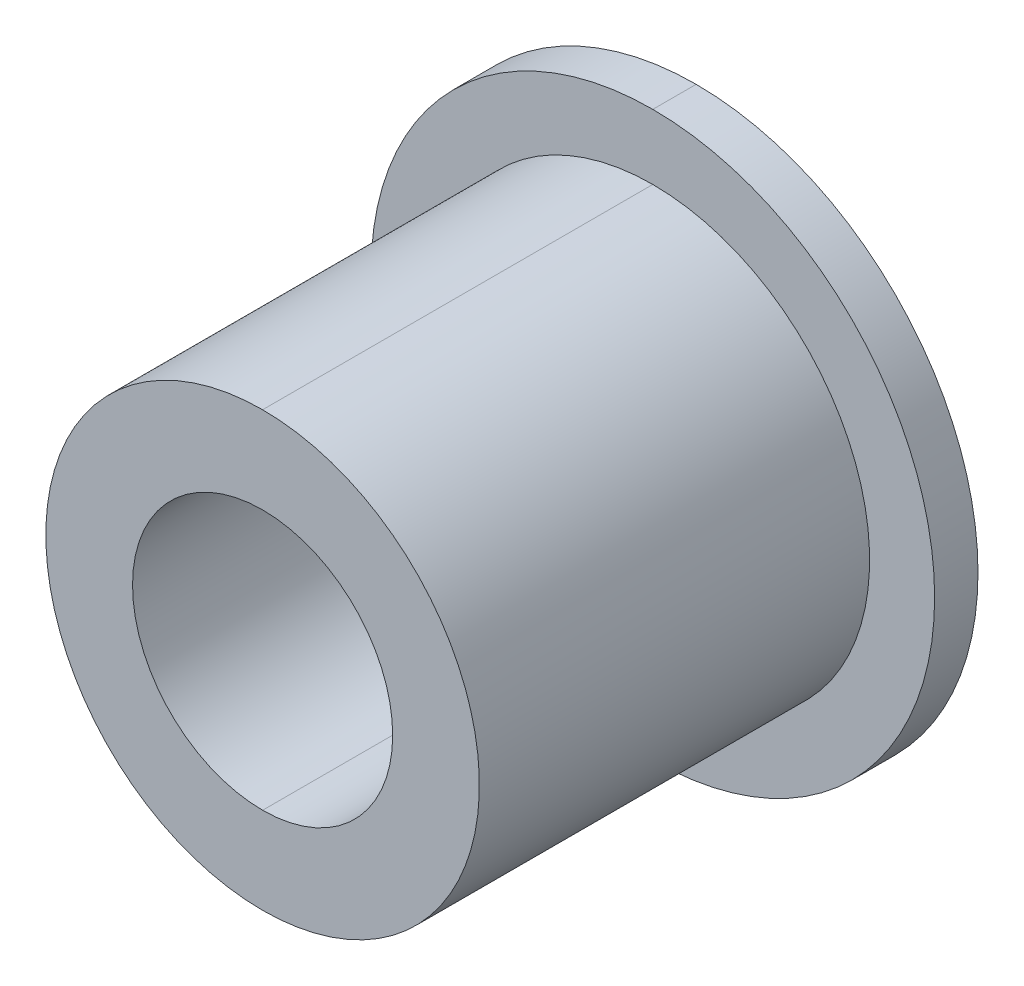
ISO-10303-21;
HEADER;
FILE_DESCRIPTION(('STEP AP214'),'2;1');
FILE_NAME('part.step','',(''),(''),'','','');
FILE_SCHEMA(('AUTOMOTIVE_DESIGN { 1 0 10303 214 1 1 1 1 }'));
ENDSEC;
DATA;
#1=APPLICATION_CONTEXT('core data for automotive mechanical design processes');
#2=APPLICATION_PROTOCOL_DEFINITION('international standard','automotive_design',2000,#1);
#3=PRODUCT_CONTEXT('',#1,'mechanical');
#4=PRODUCT('Part','Part','',(#3));
#5=PRODUCT_RELATED_PRODUCT_CATEGORY('part','',(#4));
#6=PRODUCT_DEFINITION_FORMATION('','',#4);
#7=PRODUCT_DEFINITION_CONTEXT('part definition',#1,'design');
#8=PRODUCT_DEFINITION('design','',#6,#7);
#9=PRODUCT_DEFINITION_SHAPE('','',#8);
#10=(LENGTH_UNIT() NAMED_UNIT(*) SI_UNIT(.MILLI.,.METRE.));
#11=(NAMED_UNIT(*) PLANE_ANGLE_UNIT() SI_UNIT($,.RADIAN.));
#12=(NAMED_UNIT(*) SI_UNIT($,.STERADIAN.) SOLID_ANGLE_UNIT());
#13=UNCERTAINTY_MEASURE_WITH_UNIT(LENGTH_MEASURE(1.E-05),#10,'distance_accuracy_value','');
#14=(GEOMETRIC_REPRESENTATION_CONTEXT(3) GLOBAL_UNCERTAINTY_ASSIGNED_CONTEXT((#13)) GLOBAL_UNIT_ASSIGNED_CONTEXT((#10,
#11,#12)) REPRESENTATION_CONTEXT('',''));
#15=CARTESIAN_POINT('',(0.,0.,0.));
#16=DIRECTION('',(0.,0.,1.));
#17=DIRECTION('',(1.,0.,0.));
#18=AXIS2_PLACEMENT_3D('',#15,#16,#17);
#19=CARTESIAN_POINT('',(-271.1665276998,264.3745773803,-6.700000380954));
#20=DIRECTION('',(0.,0.,-1.));
#21=DIRECTION('',(0.,-1.,0.));
#22=AXIS2_PLACEMENT_3D('',#19,#20,#21);
#23=PLANE('',#22);
#24=CARTESIAN_POINT('',(-271.1665276998,265.1245773803,-6.700000380954));
#25=DIRECTION('',(0.,0.,1.));
#26=DIRECTION('',(0.,1.,0.));
#27=AXIS2_PLACEMENT_3D('',#24,#25,#26);
#28=CIRCLE('',#27,1.5);
#29=CARTESIAN_POINT('',(-271.1665276998,266.6245773803,-6.700000380954));
#30=VERTEX_POINT('',#29);
#31=CARTESIAN_POINT('',(-271.1665276998,263.6245773803,-6.700000380954));
#32=VERTEX_POINT('',#31);
#33=EDGE_CURVE('E11',#30,#32,#28,.T.);
#34=ORIENTED_EDGE('',*,*,#33,.T.);
#35=CARTESIAN_POINT('',(-271.1665276998,265.1245773803,-6.700000380954));
#36=DIRECTION('',(0.,0.,1.));
#37=DIRECTION('',(0.,-1.,0.));
#38=AXIS2_PLACEMENT_3D('',#35,#36,#37);
#39=CIRCLE('',#38,1.5);
#40=EDGE_CURVE('E50',#32,#30,#39,.T.);
#41=ORIENTED_EDGE('',*,*,#40,.T.);
#42=EDGE_LOOP('',(#34,#41));
#43=FACE_BOUND('',#42,.T.);
#44=ADVANCED_FACE('F16',(#43),#23,.F.);
#45=CARTESIAN_POINT('',(-271.1665276998,265.1245773803,-1.600000380954));
#46=DIRECTION('',(0.,0.,-1.));
#47=DIRECTION('',(0.,-1.,0.));
#48=AXIS2_PLACEMENT_3D('',#45,#46,#47);
#49=CYLINDRICAL_SURFACE('',#48,1.5);
#50=CARTESIAN_POINT('',(-271.1665276998,265.1245773803,-1.800000380954));
#51=DIRECTION('',(0.,0.,-1.));
#52=DIRECTION('',(0.,-1.,0.));
#53=AXIS2_PLACEMENT_3D('',#50,#51,#52);
#54=CIRCLE('',#53,1.5);
#55=CARTESIAN_POINT('',(-271.1665276998,263.6245773803,-1.800000380954));
#56=VERTEX_POINT('',#55);
#57=CARTESIAN_POINT('',(-271.1665276998,266.6245773803,-1.800000380954));
#58=VERTEX_POINT('',#57);
#59=EDGE_CURVE('E46',#56,#58,#54,.T.);
#60=ORIENTED_EDGE('',*,*,#59,.F.);
#61=DIRECTION('',(0.,0.,1.));
#62=VECTOR('',#61,1.);
#63=CARTESIAN_POINT('',(-271.1665276998,263.6245773803,-6.700000380954));
#64=LINE('',#63,#62);
#65=EDGE_CURVE('E25',#32,#56,#64,.T.);
#66=ORIENTED_EDGE('',*,*,#65,.F.);
#67=ORIENTED_EDGE('',*,*,#33,.F.);
#68=DIRECTION('',(0.,0.,1.));
#69=VECTOR('',#68,1.);
#70=CARTESIAN_POINT('',(-271.1665276998,266.6245773803,-6.700000380954));
#71=LINE('',#70,#69);
#72=EDGE_CURVE('E42',#30,#58,#71,.T.);
#73=ORIENTED_EDGE('',*,*,#72,.T.);
#74=EDGE_LOOP('',(#60,#66,#67,#73));
#75=FACE_BOUND('',#74,.T.);
#76=ADVANCED_FACE('F44',(#75),#49,.F.);
#77=CARTESIAN_POINT('',(-271.1665276998,265.1245773803,-1.600000380954));
#78=DIRECTION('',(0.,0.,-1.));
#79=DIRECTION('',(0.,-1.,0.));
#80=AXIS2_PLACEMENT_3D('',#77,#78,#79);
#81=CYLINDRICAL_SURFACE('',#80,1.5);
#82=CARTESIAN_POINT('',(-271.1665276998,265.1245773803,-1.800000380954));
#83=DIRECTION('',(0.,0.,-1.));
#84=DIRECTION('',(0.,1.,0.));
#85=AXIS2_PLACEMENT_3D('',#82,#83,#84);
#86=CIRCLE('',#85,1.5);
#87=EDGE_CURVE('E51',#58,#56,#86,.T.);
#88=ORIENTED_EDGE('',*,*,#87,.F.);
#89=ORIENTED_EDGE('',*,*,#72,.F.);
#90=ORIENTED_EDGE('',*,*,#40,.F.);
#91=ORIENTED_EDGE('',*,*,#65,.T.);
#92=EDGE_LOOP('',(#88,#89,#90,#91));
#93=FACE_BOUND('',#92,.T.);
#94=ADVANCED_FACE('F54',(#93),#81,.F.);
#95=CARTESIAN_POINT('',(-271.1665276998,265.1245773803,-2.300000380954));
#96=DIRECTION('',(0.,0.,-1.));
#97=DIRECTION('',(0.,-1.,0.));
#98=AXIS2_PLACEMENT_3D('',#95,#96,#97);
#99=CYLINDRICAL_SURFACE('',#98,2.5);
#100=CARTESIAN_POINT('',(-271.1665276998,265.1245773803,-1.800000380954));
#101=DIRECTION('',(0.,0.,1.));
#102=DIRECTION('',(0.,1.,0.));
#103=AXIS2_PLACEMENT_3D('',#100,#101,#102);
#104=CIRCLE('',#103,2.5);
#105=CARTESIAN_POINT('',(-271.1665276998,267.6245773803,-1.800000380954));
#106=VERTEX_POINT('',#105);
#107=CARTESIAN_POINT('',(-271.1665276998,262.6245773803,-1.800000380954));
#108=VERTEX_POINT('',#107);
#109=EDGE_CURVE('E61',#106,#108,#104,.T.);
#110=ORIENTED_EDGE('',*,*,#109,.F.);
#111=DIRECTION('',(0.,0.,1.));
#112=VECTOR('',#111,1.);
#113=CARTESIAN_POINT('',(-271.1665276998,267.6245773803,-6.300000380954));
#114=LINE('',#113,#112);
#115=CARTESIAN_POINT('',(-271.1665276998,267.6245773803,-6.300000380954));
#116=VERTEX_POINT('',#115);
#117=EDGE_CURVE('E123',#116,#106,#114,.T.);
#118=ORIENTED_EDGE('',*,*,#117,.F.);
#119=CARTESIAN_POINT('',(-271.1665276998,265.1245773803,-6.300000380954));
#120=DIRECTION('',(0.,0.,-1.));
#121=DIRECTION('',(0.,-1.,0.));
#122=AXIS2_PLACEMENT_3D('',#119,#120,#121);
#123=CIRCLE('',#122,2.5);
#124=CARTESIAN_POINT('',(-271.1665276998,262.6245773803,-6.300000380954));
#125=VERTEX_POINT('',#124);
#126=EDGE_CURVE('E140',#125,#116,#123,.T.);
#127=ORIENTED_EDGE('',*,*,#126,.F.);
#128=DIRECTION('',(0.,0.,1.));
#129=VECTOR('',#128,1.);
#130=CARTESIAN_POINT('',(-271.1665276998,262.6245773803,-6.300000380954));
#131=LINE('',#130,#129);
#132=EDGE_CURVE('E127',#125,#108,#131,.T.);
#133=ORIENTED_EDGE('',*,*,#132,.T.);
#134=EDGE_LOOP('',(#110,#118,#127,#133));
#135=FACE_BOUND('',#134,.T.);
#136=ADVANCED_FACE('F88',(#135),#99,.T.);
#137=CARTESIAN_POINT('',(-271.1665276998,263.1245773803,-1.800000380954));
#138=DIRECTION('',(0.,0.,-1.));
#139=DIRECTION('',(0.,-1.,0.));
#140=AXIS2_PLACEMENT_3D('',#137,#138,#139);
#141=PLANE('',#140);
#142=ORIENTED_EDGE('',*,*,#59,.T.);
#143=ORIENTED_EDGE('',*,*,#87,.T.);
#144=EDGE_LOOP('',(#142,#143));
#145=FACE_BOUND('',#144,.T.);
#146=ORIENTED_EDGE('',*,*,#109,.T.);
#147=CARTESIAN_POINT('',(-271.1665276998,265.1245773803,-1.800000380954));
#148=DIRECTION('',(0.,0.,1.));
#149=DIRECTION('',(0.,-1.,0.));
#150=AXIS2_PLACEMENT_3D('',#147,#148,#149);
#151=CIRCLE('',#150,2.5);
#152=EDGE_CURVE('E70',#108,#106,#151,.T.);
#153=ORIENTED_EDGE('',*,*,#152,.T.);
#154=EDGE_LOOP('',(#146,#153));
#155=FACE_BOUND('',#154,.T.);
#156=ADVANCED_FACE('F58',(#145,#155),#141,.F.);
#157=CARTESIAN_POINT('',(-271.1665276998,265.1245773803,-2.300000380954));
#158=DIRECTION('',(0.,0.,-1.));
#159=DIRECTION('',(0.,-1.,0.));
#160=AXIS2_PLACEMENT_3D('',#157,#158,#159);
#161=CYLINDRICAL_SURFACE('',#160,2.5);
#162=ORIENTED_EDGE('',*,*,#132,.F.);
#163=CARTESIAN_POINT('',(-271.1665276998,265.1245773803,-6.300000380954));
#164=DIRECTION('',(0.,0.,-1.));
#165=DIRECTION('',(0.,1.,0.));
#166=AXIS2_PLACEMENT_3D('',#163,#164,#165);
#167=CIRCLE('',#166,2.5);
#168=EDGE_CURVE('E130',#116,#125,#167,.T.);
#169=ORIENTED_EDGE('',*,*,#168,.F.);
#170=ORIENTED_EDGE('',*,*,#117,.T.);
#171=ORIENTED_EDGE('',*,*,#152,.F.);
#172=EDGE_LOOP('',(#162,#169,#170,#171));
#173=FACE_BOUND('',#172,.T.);
#174=ADVANCED_FACE('F106',(#173),#161,.T.);
#175=CARTESIAN_POINT('',(-271.1665276998,265.1245773803,-7.300000380954));
#176=DIRECTION('',(0.,0.,-1.));
#177=DIRECTION('',(0.,-1.,0.));
#178=AXIS2_PLACEMENT_3D('',#175,#176,#177);
#179=CYLINDRICAL_SURFACE('',#178,3.25);
#180=CARTESIAN_POINT('',(-271.1665276998,265.1245773803,-6.300000380954));
#181=DIRECTION('',(0.,0.,1.));
#182=DIRECTION('',(0.,1.,0.));
#183=AXIS2_PLACEMENT_3D('',#180,#181,#182);
#184=CIRCLE('',#183,3.25);
#185=CARTESIAN_POINT('',(-271.1665276998,268.3745773803,-6.300000380954));
#186=VERTEX_POINT('',#185);
#187=CARTESIAN_POINT('',(-271.1665276998,261.8745773803,-6.300000380954));
#188=VERTEX_POINT('',#187);
#189=EDGE_CURVE('E141',#186,#188,#184,.T.);
#190=ORIENTED_EDGE('',*,*,#189,.F.);
#191=DIRECTION('',(0.,0.,1.));
#192=VECTOR('',#191,1.);
#193=CARTESIAN_POINT('',(-271.1665276998,268.3745773803,-6.800000380954));
#194=LINE('',#193,#192);
#195=CARTESIAN_POINT('',(-271.1665276998,268.3745773803,-6.800000380954));
#196=VERTEX_POINT('',#195);
#197=EDGE_CURVE('E152',#196,#186,#194,.T.);
#198=ORIENTED_EDGE('',*,*,#197,.F.);
#199=CARTESIAN_POINT('',(-271.1665276998,265.1245773803,-6.800000380954));
#200=DIRECTION('',(0.,0.,-1.));
#201=DIRECTION('',(0.,-1.,0.));
#202=AXIS2_PLACEMENT_3D('',#199,#200,#201);
#203=CIRCLE('',#202,3.25);
#204=CARTESIAN_POINT('',(-271.1665276998,261.8745773803,-6.800000380954));
#205=VERTEX_POINT('',#204);
#206=EDGE_CURVE('E164',#205,#196,#203,.T.);
#207=ORIENTED_EDGE('',*,*,#206,.F.);
#208=DIRECTION('',(0.,0.,1.));
#209=VECTOR('',#208,1.);
#210=CARTESIAN_POINT('',(-271.1665276998,261.8745773803,-6.800000380954));
#211=LINE('',#210,#209);
#212=EDGE_CURVE('E155',#205,#188,#211,.T.);
#213=ORIENTED_EDGE('',*,*,#212,.T.);
#214=EDGE_LOOP('',(#190,#198,#207,#213));
#215=FACE_BOUND('',#214,.T.);
#216=ADVANCED_FACE('F102',(#215),#179,.T.);
#217=CARTESIAN_POINT('',(-271.1665276998,262.1245773803,-6.300000380954));
#218=DIRECTION('',(0.,0.,-1.));
#219=DIRECTION('',(0.,-1.,0.));
#220=AXIS2_PLACEMENT_3D('',#217,#218,#219);
#221=PLANE('',#220);
#222=ORIENTED_EDGE('',*,*,#126,.T.);
#223=ORIENTED_EDGE('',*,*,#168,.T.);
#224=EDGE_LOOP('',(#222,#223));
#225=FACE_BOUND('',#224,.T.);
#226=ORIENTED_EDGE('',*,*,#189,.T.);
#227=CARTESIAN_POINT('',(-271.1665276998,265.1245773803,-6.300000380954));
#228=DIRECTION('',(0.,0.,1.));
#229=DIRECTION('',(0.,-1.,0.));
#230=AXIS2_PLACEMENT_3D('',#227,#228,#229);
#231=CIRCLE('',#230,3.25);
#232=EDGE_CURVE('E146',#188,#186,#231,.T.);
#233=ORIENTED_EDGE('',*,*,#232,.T.);
#234=EDGE_LOOP('',(#226,#233));
#235=FACE_BOUND('',#234,.T.);
#236=ADVANCED_FACE('F98',(#225,#235),#221,.F.);
#237=CARTESIAN_POINT('',(-271.1665276998,265.1245773803,-7.300000380954));
#238=DIRECTION('',(0.,0.,-1.));
#239=DIRECTION('',(0.,-1.,0.));
#240=AXIS2_PLACEMENT_3D('',#237,#238,#239);
#241=CYLINDRICAL_SURFACE('',#240,3.25);
#242=ORIENTED_EDGE('',*,*,#212,.F.);
#243=CARTESIAN_POINT('',(-271.1665276998,265.1245773803,-6.800000380954));
#244=DIRECTION('',(0.,0.,-1.));
#245=DIRECTION('',(0.,1.,0.));
#246=AXIS2_PLACEMENT_3D('',#243,#244,#245);
#247=CIRCLE('',#246,3.25);
#248=EDGE_CURVE('E160',#196,#205,#247,.T.);
#249=ORIENTED_EDGE('',*,*,#248,.F.);
#250=ORIENTED_EDGE('',*,*,#197,.T.);
#251=ORIENTED_EDGE('',*,*,#232,.F.);
#252=EDGE_LOOP('',(#242,#249,#250,#251));
#253=FACE_BOUND('',#252,.T.);
#254=ADVANCED_FACE('F94',(#253),#241,.T.);
#255=CARTESIAN_POINT('',(-502.1665277148,272.5945772562,-6.800000380954));
#256=DIRECTION('',(0.,0.,-1.));
#257=DIRECTION('',(0.,-1.,0.));
#258=AXIS2_PLACEMENT_3D('',#255,#256,#257);
#259=PLANE('',#258);
#260=ORIENTED_EDGE('',*,*,#206,.T.);
#261=ORIENTED_EDGE('',*,*,#248,.T.);
#262=EDGE_LOOP('',(#260,#261));
#263=FACE_BOUND('',#262,.T.);
#264=ADVANCED_FACE('F91',(#263),#259,.T.);
#265=CLOSED_SHELL('',(#44,#76,#94,#136,#156,#174,#216,#236,#254,#264));
#266=MANIFOLD_SOLID_BREP('B1',#265);
#267=ADVANCED_BREP_SHAPE_REPRESENTATION('',(#18,#266),#14);
#268=SHAPE_DEFINITION_REPRESENTATION(#9,#267);
ENDSEC;
END-ISO-10303-21;
